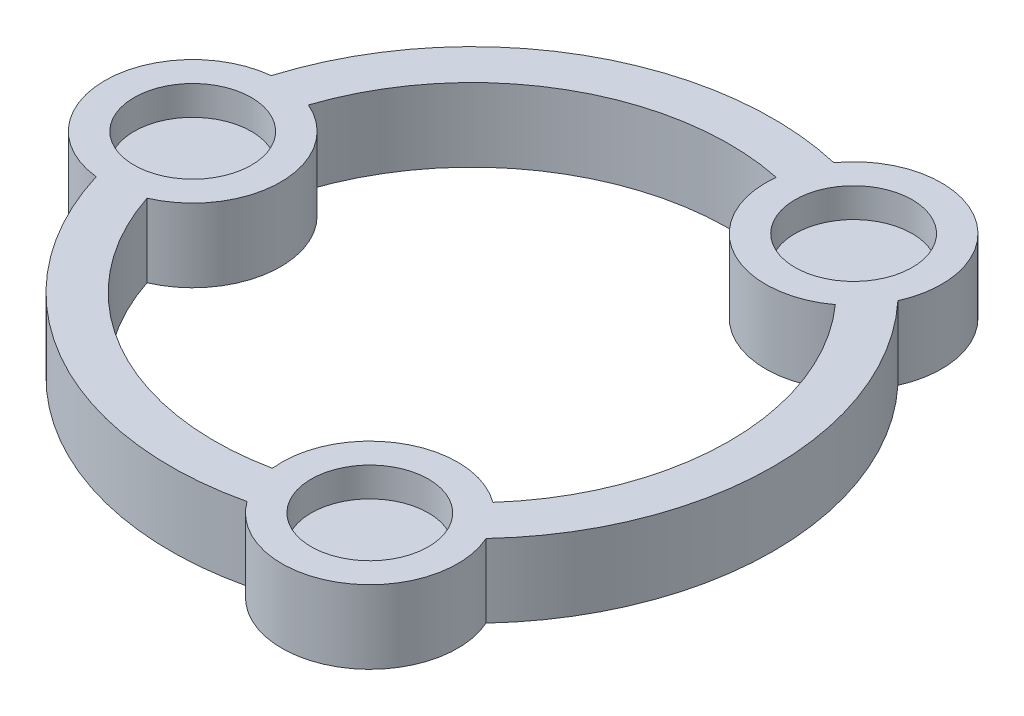
ISO-10303-21;
HEADER;
FILE_DESCRIPTION(('STEP AP214'),'2;1');
FILE_NAME('part.step','',(''),(''),'','','');
FILE_SCHEMA(('AUTOMOTIVE_DESIGN { 1 0 10303 214 1 1 1 1 }'));
ENDSEC;
DATA;
#1=APPLICATION_CONTEXT('core data for automotive mechanical design processes');
#2=APPLICATION_PROTOCOL_DEFINITION('international standard','automotive_design',2000,#1);
#3=PRODUCT_CONTEXT('',#1,'mechanical');
#4=PRODUCT('Part','Part','',(#3));
#5=PRODUCT_RELATED_PRODUCT_CATEGORY('part','',(#4));
#6=PRODUCT_DEFINITION_FORMATION('','',#4);
#7=PRODUCT_DEFINITION_CONTEXT('part definition',#1,'design');
#8=PRODUCT_DEFINITION('design','',#6,#7);
#9=PRODUCT_DEFINITION_SHAPE('','',#8);
#10=(LENGTH_UNIT() NAMED_UNIT(*) SI_UNIT(.MILLI.,.METRE.));
#11=(NAMED_UNIT(*) PLANE_ANGLE_UNIT() SI_UNIT($,.RADIAN.));
#12=(NAMED_UNIT(*) SI_UNIT($,.STERADIAN.) SOLID_ANGLE_UNIT());
#13=UNCERTAINTY_MEASURE_WITH_UNIT(LENGTH_MEASURE(1.E-05),#10,'distance_accuracy_value','');
#14=(GEOMETRIC_REPRESENTATION_CONTEXT(3) GLOBAL_UNCERTAINTY_ASSIGNED_CONTEXT((#13)) GLOBAL_UNIT_ASSIGNED_CONTEXT((#10,
#11,#12)) REPRESENTATION_CONTEXT('',''));
#15=CARTESIAN_POINT('',(0.,0.,0.));
#16=DIRECTION('',(0.,0.,1.));
#17=DIRECTION('',(1.,0.,0.));
#18=AXIS2_PLACEMENT_3D('',#15,#16,#17);
#19=CARTESIAN_POINT('',(0.,5.,2.99231768478796E-13));
#20=DIRECTION('',(0.,1.,0.));
#21=DIRECTION('',(0.,0.,1.));
#22=AXIS2_PLACEMENT_3D('',#19,#20,#21);
#23=PLANE('',#22);
#24=CARTESIAN_POINT('',(4.05925293378573E-13,5.,0.));
#25=DIRECTION('',(0.,1.,0.));
#26=DIRECTION('',(0.,0.,1.));
#27=AXIS2_PLACEMENT_3D('',#24,#25,#26);
#28=CIRCLE('',#27,17.5500000000002);
#29=CARTESIAN_POINT('',(-16.6644864519089,5.,5.50430661338338));
#30=VERTEX_POINT('',#29);
#31=CARTESIAN_POINT('',(3.56537386854582,5.,17.1840219150669));
#32=VERTEX_POINT('',#31);
#33=EDGE_CURVE('E213',#30,#32,#28,.T.);
#34=ORIENTED_EDGE('',*,*,#33,.F.);
#35=CARTESIAN_POINT('',(-19.0524999999996,5.,0.));
#36=DIRECTION('',(0.,1.,0.));
#37=DIRECTION('',(0.,0.,1.));
#38=AXIS2_PLACEMENT_3D('',#35,#36,#37);
#39=CIRCLE('',#38,6.);
#40=CARTESIAN_POINT('',(-16.6644864519086,5.,-5.50430661338373));
#41=VERTEX_POINT('',#40);
#42=EDGE_CURVE('E185',#30,#41,#39,.T.);
#43=ORIENTED_EDGE('',*,*,#42,.T.);
#44=CARTESIAN_POINT('',(4.05925293378573E-13,5.,0.));
#45=DIRECTION('',(0.,1.,0.));
#46=DIRECTION('',(0.,0.,1.));
#47=AXIS2_PLACEMENT_3D('',#44,#45,#46);
#48=CIRCLE('',#47,17.55);
#49=CARTESIAN_POINT('',(3.56537386854619,5.,-17.1840219150666));
#50=VERTEX_POINT('',#49);
#51=EDGE_CURVE('E196',#50,#41,#48,.T.);
#52=ORIENTED_EDGE('',*,*,#51,.F.);
#53=CARTESIAN_POINT('',(9.52625000000018,5.,-16.4999490056029));
#54=DIRECTION('',(0.,1.,0.));
#55=DIRECTION('',(0.,0.,1.));
#56=AXIS2_PLACEMENT_3D('',#53,#54,#55);
#57=CIRCLE('',#56,6.);
#58=CARTESIAN_POINT('',(13.0991125833636,5.,-11.6797153016834));
#59=VERTEX_POINT('',#58);
#60=EDGE_CURVE('E222',#50,#59,#57,.T.);
#61=ORIENTED_EDGE('',*,*,#60,.T.);
#62=CARTESIAN_POINT('',(4.05925293378573E-13,5.,0.));
#63=DIRECTION('',(0.,1.,0.));
#64=DIRECTION('',(0.,0.,1.));
#65=AXIS2_PLACEMENT_3D('',#62,#63,#64);
#66=CIRCLE('',#65,17.55);
#67=CARTESIAN_POINT('',(13.0991125833638,5.,11.6797153016833));
#68=VERTEX_POINT('',#67);
#69=EDGE_CURVE('E219',#68,#59,#66,.T.);
#70=ORIENTED_EDGE('',*,*,#69,.F.);
#71=CARTESIAN_POINT('',(9.52625000000006,5.,16.4999490056029));
#72=DIRECTION('',(0.,1.,0.));
#73=DIRECTION('',(0.,0.,1.));
#74=AXIS2_PLACEMENT_3D('',#71,#72,#73);
#75=CIRCLE('',#74,6.00000000000029);
#76=EDGE_CURVE('E216',#68,#32,#75,.T.);
#77=ORIENTED_EDGE('',*,*,#76,.T.);
#78=EDGE_LOOP('',(#34,#43,#52,#61,#70,#77));
#79=FACE_BOUND('',#78,.T.);
#80=CARTESIAN_POINT('',(9.52625000000006,5.,16.4999490056029));
#81=DIRECTION('',(0.,-1.,0.));
#82=DIRECTION('',(0.,0.,-1.));
#83=AXIS2_PLACEMENT_3D('',#80,#81,#82);
#84=CIRCLE('',#83,4.);
#85=CARTESIAN_POINT('',(9.52625000000006,5.,12.4999490056029));
#86=VERTEX_POINT('',#85);
#87=EDGE_CURVE('E243',#86,#86,#84,.T.);
#88=ORIENTED_EDGE('',*,*,#87,.T.);
#89=EDGE_LOOP('',(#88));
#90=FACE_BOUND('',#89,.T.);
#91=CARTESIAN_POINT('',(9.52625000000018,5.,-16.4999490056029));
#92=DIRECTION('',(0.,-1.,0.));
#93=DIRECTION('',(0.,0.,-1.));
#94=AXIS2_PLACEMENT_3D('',#91,#92,#93);
#95=CIRCLE('',#94,4.);
#96=CARTESIAN_POINT('',(9.52625000000018,5.,-20.4999490056029));
#97=VERTEX_POINT('',#96);
#98=EDGE_CURVE('E59',#97,#97,#95,.T.);
#99=ORIENTED_EDGE('',*,*,#98,.T.);
#100=EDGE_LOOP('',(#99));
#101=FACE_BOUND('',#100,.T.);
#102=CARTESIAN_POINT('',(-19.0524999999996,5.,0.));
#103=DIRECTION('',(0.,-1.,0.));
#104=DIRECTION('',(0.,0.,-1.));
#105=AXIS2_PLACEMENT_3D('',#102,#103,#104);
#106=CIRCLE('',#105,4.);
#107=CARTESIAN_POINT('',(-19.0524999999996,5.,-3.99999999999994));
#108=VERTEX_POINT('',#107);
#109=EDGE_CURVE('E229',#108,#108,#106,.T.);
#110=ORIENTED_EDGE('',*,*,#109,.T.);
#111=EDGE_LOOP('',(#110));
#112=FACE_BOUND('',#111,.T.);
#113=CARTESIAN_POINT('',(0.,5.,2.99231768478796E-13));
#114=DIRECTION('',(0.,1.,0.));
#115=DIRECTION('',(0.,0.,1.));
#116=AXIS2_PLACEMENT_3D('',#113,#114,#115);
#117=CIRCLE('',#116,20.5500000000001);
#118=CARTESIAN_POINT('',(4.66295889171505,5.,-20.0139779747597));
#119=VERTEX_POINT('',#118);
#120=CARTESIAN_POINT('',(-19.6640928027817,5.,-5.96874813035245));
#121=VERTEX_POINT('',#120);
#122=EDGE_CURVE('E173',#119,#121,#117,.T.);
#123=ORIENTED_EDGE('',*,*,#122,.T.);
#124=CARTESIAN_POINT('',(-19.0524999999996,5.,0.));
#125=DIRECTION('',(0.,1.,0.));
#126=DIRECTION('',(0.,0.,1.));
#127=AXIS2_PLACEMENT_3D('',#124,#125,#126);
#128=CIRCLE('',#127,6.);
#129=CARTESIAN_POINT('',(-19.6640928027814,5.,5.96874813035254));
#130=VERTEX_POINT('',#129);
#131=EDGE_CURVE('E70',#121,#130,#128,.T.);
#132=ORIENTED_EDGE('',*,*,#131,.T.);
#133=CARTESIAN_POINT('',(0.,5.,2.99231768478796E-13));
#134=DIRECTION('',(0.,1.,0.));
#135=DIRECTION('',(0.,0.,1.));
#136=AXIS2_PLACEMENT_3D('',#133,#134,#135);
#137=CIRCLE('',#136,20.5499999999997);
#138=CARTESIAN_POINT('',(4.66295889171485,5.,20.01397797476));
#139=VERTEX_POINT('',#138);
#140=EDGE_CURVE('E160',#130,#139,#137,.T.);
#141=ORIENTED_EDGE('',*,*,#140,.T.);
#142=CARTESIAN_POINT('',(9.52625000000006,5.,16.4999490056029));
#143=DIRECTION('',(0.,1.,0.));
#144=DIRECTION('',(0.,0.,1.));
#145=AXIS2_PLACEMENT_3D('',#142,#143,#144);
#146=CIRCLE('',#145,6.00000000000014);
#147=CARTESIAN_POINT('',(15.0011339110674,5.,14.0452298444078));
#148=VERTEX_POINT('',#147);
#149=EDGE_CURVE('E163',#139,#148,#146,.T.);
#150=ORIENTED_EDGE('',*,*,#149,.T.);
#151=CARTESIAN_POINT('',(0.,5.,2.99231768478796E-13));
#152=DIRECTION('',(0.,1.,0.));
#153=DIRECTION('',(0.,0.,1.));
#154=AXIS2_PLACEMENT_3D('',#151,#152,#153);
#155=CIRCLE('',#154,20.5500000000002);
#156=CARTESIAN_POINT('',(15.0011339110671,5.,-14.0452298444075));
#157=VERTEX_POINT('',#156);
#158=EDGE_CURVE('E178',#148,#157,#155,.T.);
#159=ORIENTED_EDGE('',*,*,#158,.T.);
#160=CARTESIAN_POINT('',(9.52625000000018,5.,-16.4999490056029));
#161=DIRECTION('',(0.,1.,0.));
#162=DIRECTION('',(0.,0.,1.));
#163=AXIS2_PLACEMENT_3D('',#160,#161,#162);
#164=CIRCLE('',#163,6.);
#165=EDGE_CURVE('E175',#157,#119,#164,.T.);
#166=ORIENTED_EDGE('',*,*,#165,.T.);
#167=EDGE_LOOP('',(#123,#132,#141,#150,#159,#166));
#168=FACE_BOUND('',#167,.T.);
#169=ADVANCED_FACE('F55',(#79,#90,#101,#112,#168),#23,.T.);
#170=CARTESIAN_POINT('',(0.,0.,2.99231768478796E-13));
#171=DIRECTION('',(0.,1.,0.));
#172=DIRECTION('',(0.,0.,1.));
#173=AXIS2_PLACEMENT_3D('',#170,#171,#172);
#174=PLANE('',#173);
#175=CARTESIAN_POINT('',(-19.0524999999996,0.,0.));
#176=DIRECTION('',(0.,1.,0.));
#177=DIRECTION('',(0.,0.,1.));
#178=AXIS2_PLACEMENT_3D('',#175,#176,#177);
#179=CIRCLE('',#178,6.);
#180=CARTESIAN_POINT('',(-16.6644864519089,0.,5.50430661338338));
#181=VERTEX_POINT('',#180);
#182=CARTESIAN_POINT('',(-16.6644864519086,0.,-5.50430661338373));
#183=VERTEX_POINT('',#182);
#184=EDGE_CURVE('E193',#181,#183,#179,.T.);
#185=ORIENTED_EDGE('',*,*,#184,.F.);
#186=CARTESIAN_POINT('',(4.05925293378573E-13,0.,0.));
#187=DIRECTION('',(0.,1.,0.));
#188=DIRECTION('',(0.,0.,1.));
#189=AXIS2_PLACEMENT_3D('',#186,#187,#188);
#190=CIRCLE('',#189,17.5500000000002);
#191=CARTESIAN_POINT('',(3.56537386854582,0.,17.1840219150669));
#192=VERTEX_POINT('',#191);
#193=EDGE_CURVE('E195',#181,#192,#190,.T.);
#194=ORIENTED_EDGE('',*,*,#193,.T.);
#195=CARTESIAN_POINT('',(9.52625000000006,0.,16.4999490056029));
#196=DIRECTION('',(0.,1.,0.));
#197=DIRECTION('',(0.,0.,1.));
#198=AXIS2_PLACEMENT_3D('',#195,#196,#197);
#199=CIRCLE('',#198,6.00000000000029);
#200=CARTESIAN_POINT('',(13.0991125833638,0.,11.6797153016833));
#201=VERTEX_POINT('',#200);
#202=EDGE_CURVE('E199',#201,#192,#199,.T.);
#203=ORIENTED_EDGE('',*,*,#202,.F.);
#204=CARTESIAN_POINT('',(4.05925293378573E-13,0.,0.));
#205=DIRECTION('',(0.,1.,0.));
#206=DIRECTION('',(0.,0.,1.));
#207=AXIS2_PLACEMENT_3D('',#204,#205,#206);
#208=CIRCLE('',#207,17.55);
#209=CARTESIAN_POINT('',(13.0991125833636,0.,-11.6797153016834));
#210=VERTEX_POINT('',#209);
#211=EDGE_CURVE('E202',#201,#210,#208,.T.);
#212=ORIENTED_EDGE('',*,*,#211,.T.);
#213=CARTESIAN_POINT('',(9.52625000000018,0.,-16.4999490056029));
#214=DIRECTION('',(0.,1.,0.));
#215=DIRECTION('',(0.,0.,1.));
#216=AXIS2_PLACEMENT_3D('',#213,#214,#215);
#217=CIRCLE('',#216,6.);
#218=CARTESIAN_POINT('',(3.56537386854619,0.,-17.1840219150666));
#219=VERTEX_POINT('',#218);
#220=EDGE_CURVE('E205',#219,#210,#217,.T.);
#221=ORIENTED_EDGE('',*,*,#220,.F.);
#222=CARTESIAN_POINT('',(4.05925293378573E-13,0.,0.));
#223=DIRECTION('',(0.,1.,0.));
#224=DIRECTION('',(0.,0.,1.));
#225=AXIS2_PLACEMENT_3D('',#222,#223,#224);
#226=CIRCLE('',#225,17.55);
#227=EDGE_CURVE('E207',#219,#183,#226,.T.);
#228=ORIENTED_EDGE('',*,*,#227,.T.);
#229=EDGE_LOOP('',(#185,#194,#203,#212,#221,#228));
#230=FACE_BOUND('',#229,.T.);
#231=CARTESIAN_POINT('',(-19.0524999999996,0.,0.));
#232=DIRECTION('',(0.,1.,0.));
#233=DIRECTION('',(0.,0.,1.));
#234=AXIS2_PLACEMENT_3D('',#231,#232,#233);
#235=CIRCLE('',#234,6.);
#236=CARTESIAN_POINT('',(-19.6640928027817,0.,-5.96874813035245));
#237=VERTEX_POINT('',#236);
#238=CARTESIAN_POINT('',(-19.6640928027814,0.,5.96874813035254));
#239=VERTEX_POINT('',#238);
#240=EDGE_CURVE('E152',#237,#239,#235,.T.);
#241=ORIENTED_EDGE('',*,*,#240,.F.);
#242=CARTESIAN_POINT('',(0.,0.,2.99231768478796E-13));
#243=DIRECTION('',(0.,1.,0.));
#244=DIRECTION('',(0.,0.,1.));
#245=AXIS2_PLACEMENT_3D('',#242,#243,#244);
#246=CIRCLE('',#245,20.5500000000001);
#247=CARTESIAN_POINT('',(4.66295889171505,0.,-20.0139779747597));
#248=VERTEX_POINT('',#247);
#249=EDGE_CURVE('E144',#248,#237,#246,.T.);
#250=ORIENTED_EDGE('',*,*,#249,.F.);
#251=CARTESIAN_POINT('',(9.52625000000018,0.,-16.4999490056029));
#252=DIRECTION('',(0.,1.,0.));
#253=DIRECTION('',(0.,0.,1.));
#254=AXIS2_PLACEMENT_3D('',#251,#252,#253);
#255=CIRCLE('',#254,6.);
#256=CARTESIAN_POINT('',(15.0011339110671,0.,-14.0452298444075));
#257=VERTEX_POINT('',#256);
#258=EDGE_CURVE('E151',#257,#248,#255,.T.);
#259=ORIENTED_EDGE('',*,*,#258,.F.);
#260=CARTESIAN_POINT('',(0.,0.,2.99231768478796E-13));
#261=DIRECTION('',(0.,1.,0.));
#262=DIRECTION('',(0.,0.,1.));
#263=AXIS2_PLACEMENT_3D('',#260,#261,#262);
#264=CIRCLE('',#263,20.5500000000002);
#265=CARTESIAN_POINT('',(15.0011339110674,0.,14.0452298444078));
#266=VERTEX_POINT('',#265);
#267=EDGE_CURVE('E167',#266,#257,#264,.T.);
#268=ORIENTED_EDGE('',*,*,#267,.F.);
#269=CARTESIAN_POINT('',(9.52625000000006,0.,16.4999490056029));
#270=DIRECTION('',(0.,1.,0.));
#271=DIRECTION('',(0.,0.,1.));
#272=AXIS2_PLACEMENT_3D('',#269,#270,#271);
#273=CIRCLE('',#272,6.00000000000014);
#274=CARTESIAN_POINT('',(4.66295889171485,0.,20.01397797476));
#275=VERTEX_POINT('',#274);
#276=EDGE_CURVE('E169',#275,#266,#273,.T.);
#277=ORIENTED_EDGE('',*,*,#276,.F.);
#278=CARTESIAN_POINT('',(0.,0.,2.99231768478796E-13));
#279=DIRECTION('',(0.,1.,0.));
#280=DIRECTION('',(0.,0.,1.));
#281=AXIS2_PLACEMENT_3D('',#278,#279,#280);
#282=CIRCLE('',#281,20.5499999999997);
#283=EDGE_CURVE('E156',#239,#275,#282,.T.);
#284=ORIENTED_EDGE('',*,*,#283,.F.);
#285=EDGE_LOOP('',(#241,#250,#259,#268,#277,#284));
#286=FACE_BOUND('',#285,.T.);
#287=ADVANCED_FACE('F57',(#230,#286),#174,.F.);
#288=CARTESIAN_POINT('',(9.52625000000018,3.,-16.4999490056029));
#289=DIRECTION('',(0.,1.,0.));
#290=DIRECTION('',(0.,0.,1.));
#291=AXIS2_PLACEMENT_3D('',#288,#289,#290);
#292=CYLINDRICAL_SURFACE('',#291,4.);
#293=CARTESIAN_POINT('',(9.52625000000018,3.,-16.4999490056029));
#294=DIRECTION('',(0.,-1.,0.));
#295=DIRECTION('',(0.,0.,-1.));
#296=AXIS2_PLACEMENT_3D('',#293,#294,#295);
#297=CIRCLE('',#296,4.);
#298=CARTESIAN_POINT('',(9.52625000000018,3.,-20.4999490056029));
#299=VERTEX_POINT('',#298);
#300=EDGE_CURVE('E12',#299,#299,#297,.T.);
#301=ORIENTED_EDGE('',*,*,#300,.T.);
#302=EDGE_LOOP('',(#301));
#303=FACE_BOUND('',#302,.T.);
#304=ORIENTED_EDGE('',*,*,#98,.F.);
#305=EDGE_LOOP('',(#304));
#306=FACE_BOUND('',#305,.T.);
#307=ADVANCED_FACE('F267',(#303,#306),#292,.F.);
#308=CARTESIAN_POINT('',(9.52625000000018,3.,-16.4999490056029));
#309=DIRECTION('',(0.,-1.,0.));
#310=DIRECTION('',(0.,0.,-1.));
#311=AXIS2_PLACEMENT_3D('',#308,#309,#310);
#312=PLANE('',#311);
#313=ORIENTED_EDGE('',*,*,#300,.F.);
#314=EDGE_LOOP('',(#313));
#315=FACE_BOUND('',#314,.T.);
#316=ADVANCED_FACE('F257',(#315),#312,.F.);
#317=CARTESIAN_POINT('',(9.52625000000006,3.,16.4999490056029));
#318=DIRECTION('',(0.,1.,0.));
#319=DIRECTION('',(0.,0.,1.));
#320=AXIS2_PLACEMENT_3D('',#317,#318,#319);
#321=CYLINDRICAL_SURFACE('',#320,4.);
#322=CARTESIAN_POINT('',(9.52625000000006,3.,16.4999490056029));
#323=DIRECTION('',(0.,-1.,0.));
#324=DIRECTION('',(0.,0.,-1.));
#325=AXIS2_PLACEMENT_3D('',#322,#323,#324);
#326=CIRCLE('',#325,4.);
#327=CARTESIAN_POINT('',(9.52625000000006,3.,12.4999490056029));
#328=VERTEX_POINT('',#327);
#329=EDGE_CURVE('E246',#328,#328,#326,.T.);
#330=ORIENTED_EDGE('',*,*,#329,.T.);
#331=EDGE_LOOP('',(#330));
#332=FACE_BOUND('',#331,.T.);
#333=ORIENTED_EDGE('',*,*,#87,.F.);
#334=EDGE_LOOP('',(#333));
#335=FACE_BOUND('',#334,.T.);
#336=ADVANCED_FACE('F254',(#332,#335),#321,.F.);
#337=CARTESIAN_POINT('',(9.52625000000006,3.,16.4999490056029));
#338=DIRECTION('',(0.,-1.,0.));
#339=DIRECTION('',(0.,0.,-1.));
#340=AXIS2_PLACEMENT_3D('',#337,#338,#339);
#341=PLANE('',#340);
#342=ORIENTED_EDGE('',*,*,#329,.F.);
#343=EDGE_LOOP('',(#342));
#344=FACE_BOUND('',#343,.T.);
#345=ADVANCED_FACE('F256',(#344),#341,.F.);
#346=CARTESIAN_POINT('',(-19.0524999999996,3.,0.));
#347=DIRECTION('',(0.,1.,0.));
#348=DIRECTION('',(0.,0.,1.));
#349=AXIS2_PLACEMENT_3D('',#346,#347,#348);
#350=CYLINDRICAL_SURFACE('',#349,4.);
#351=CARTESIAN_POINT('',(-19.0524999999996,3.,0.));
#352=DIRECTION('',(0.,-1.,0.));
#353=DIRECTION('',(0.,0.,-1.));
#354=AXIS2_PLACEMENT_3D('',#351,#352,#353);
#355=CIRCLE('',#354,4.);
#356=CARTESIAN_POINT('',(-19.0524999999996,3.,-3.99999999999994));
#357=VERTEX_POINT('',#356);
#358=EDGE_CURVE('E240',#357,#357,#355,.T.);
#359=ORIENTED_EDGE('',*,*,#358,.T.);
#360=EDGE_LOOP('',(#359));
#361=FACE_BOUND('',#360,.T.);
#362=ORIENTED_EDGE('',*,*,#109,.F.);
#363=EDGE_LOOP('',(#362));
#364=FACE_BOUND('',#363,.T.);
#365=ADVANCED_FACE('F264',(#361,#364),#350,.F.);
#366=CARTESIAN_POINT('',(-19.0524999999996,3.,0.));
#367=DIRECTION('',(0.,-1.,0.));
#368=DIRECTION('',(0.,0.,-1.));
#369=AXIS2_PLACEMENT_3D('',#366,#367,#368);
#370=PLANE('',#369);
#371=ORIENTED_EDGE('',*,*,#358,.F.);
#372=EDGE_LOOP('',(#371));
#373=FACE_BOUND('',#372,.T.);
#374=ADVANCED_FACE('F342',(#373),#370,.F.);
#375=CARTESIAN_POINT('',(-19.0524999999996,0.,0.));
#376=DIRECTION('',(0.,1.,0.));
#377=DIRECTION('',(0.,0.,1.));
#378=AXIS2_PLACEMENT_3D('',#375,#376,#377);
#379=CYLINDRICAL_SURFACE('',#378,6.);
#380=ORIENTED_EDGE('',*,*,#42,.F.);
#381=DIRECTION('',(0.,1.,0.));
#382=VECTOR('',#381,1.);
#383=CARTESIAN_POINT('',(-16.6644864519089,0.,5.50430661338338));
#384=LINE('',#383,#382);
#385=EDGE_CURVE('E210',#181,#30,#384,.T.);
#386=ORIENTED_EDGE('',*,*,#385,.F.);
#387=ORIENTED_EDGE('',*,*,#184,.T.);
#388=DIRECTION('',(0.,1.,0.));
#389=VECTOR('',#388,1.);
#390=CARTESIAN_POINT('',(-16.6644864519086,0.,-5.50430661338373));
#391=LINE('',#390,#389);
#392=EDGE_CURVE('E227',#183,#41,#391,.T.);
#393=ORIENTED_EDGE('',*,*,#392,.T.);
#394=EDGE_LOOP('',(#380,#386,#387,#393));
#395=FACE_BOUND('',#394,.T.);
#396=ADVANCED_FACE('F324',(#395),#379,.T.);
#397=CARTESIAN_POINT('',(4.05925293378573E-13,0.,0.));
#398=DIRECTION('',(0.,1.,0.));
#399=DIRECTION('',(0.,0.,1.));
#400=AXIS2_PLACEMENT_3D('',#397,#398,#399);
#401=CYLINDRICAL_SURFACE('',#400,17.55);
#402=ORIENTED_EDGE('',*,*,#51,.T.);
#403=ORIENTED_EDGE('',*,*,#392,.F.);
#404=ORIENTED_EDGE('',*,*,#227,.F.);
#405=DIRECTION('',(0.,1.,0.));
#406=VECTOR('',#405,1.);
#407=CARTESIAN_POINT('',(3.56537386854619,0.,-17.1840219150666));
#408=LINE('',#407,#406);
#409=EDGE_CURVE('E230',#219,#50,#408,.T.);
#410=ORIENTED_EDGE('',*,*,#409,.T.);
#411=EDGE_LOOP('',(#402,#403,#404,#410));
#412=FACE_BOUND('',#411,.T.);
#413=ADVANCED_FACE('F320',(#412),#401,.F.);
#414=CARTESIAN_POINT('',(9.52625000000018,0.,-16.4999490056029));
#415=DIRECTION('',(0.,1.,0.));
#416=DIRECTION('',(0.,0.,1.));
#417=AXIS2_PLACEMENT_3D('',#414,#415,#416);
#418=CYLINDRICAL_SURFACE('',#417,6.);
#419=ORIENTED_EDGE('',*,*,#60,.F.);
#420=ORIENTED_EDGE('',*,*,#409,.F.);
#421=ORIENTED_EDGE('',*,*,#220,.T.);
#422=DIRECTION('',(0.,1.,0.));
#423=VECTOR('',#422,1.);
#424=CARTESIAN_POINT('',(13.0991125833636,0.,-11.6797153016834));
#425=LINE('',#424,#423);
#426=EDGE_CURVE('E232',#210,#59,#425,.T.);
#427=ORIENTED_EDGE('',*,*,#426,.T.);
#428=EDGE_LOOP('',(#419,#420,#421,#427));
#429=FACE_BOUND('',#428,.T.);
#430=ADVANCED_FACE('F323',(#429),#418,.T.);
#431=CARTESIAN_POINT('',(4.05925293378573E-13,0.,0.));
#432=DIRECTION('',(0.,1.,0.));
#433=DIRECTION('',(0.,0.,1.));
#434=AXIS2_PLACEMENT_3D('',#431,#432,#433);
#435=CYLINDRICAL_SURFACE('',#434,17.55);
#436=ORIENTED_EDGE('',*,*,#69,.T.);
#437=ORIENTED_EDGE('',*,*,#426,.F.);
#438=ORIENTED_EDGE('',*,*,#211,.F.);
#439=DIRECTION('',(0.,1.,0.));
#440=VECTOR('',#439,1.);
#441=CARTESIAN_POINT('',(13.0991125833638,0.,11.6797153016833));
#442=LINE('',#441,#440);
#443=EDGE_CURVE('E234',#201,#68,#442,.T.);
#444=ORIENTED_EDGE('',*,*,#443,.T.);
#445=EDGE_LOOP('',(#436,#437,#438,#444));
#446=FACE_BOUND('',#445,.T.);
#447=ADVANCED_FACE('F328',(#446),#435,.F.);
#448=CARTESIAN_POINT('',(9.52625000000006,0.,16.4999490056029));
#449=DIRECTION('',(0.,1.,0.));
#450=DIRECTION('',(0.,0.,1.));
#451=AXIS2_PLACEMENT_3D('',#448,#449,#450);
#452=CYLINDRICAL_SURFACE('',#451,6.00000000000029);
#453=ORIENTED_EDGE('',*,*,#76,.F.);
#454=ORIENTED_EDGE('',*,*,#443,.F.);
#455=ORIENTED_EDGE('',*,*,#202,.T.);
#456=DIRECTION('',(0.,1.,0.));
#457=VECTOR('',#456,1.);
#458=CARTESIAN_POINT('',(3.56537386854582,0.,17.1840219150669));
#459=LINE('',#458,#457);
#460=EDGE_CURVE('E236',#192,#32,#459,.T.);
#461=ORIENTED_EDGE('',*,*,#460,.T.);
#462=EDGE_LOOP('',(#453,#454,#455,#461));
#463=FACE_BOUND('',#462,.T.);
#464=ADVANCED_FACE('F332',(#463),#452,.T.);
#465=CARTESIAN_POINT('',(4.05925293378573E-13,0.,0.));
#466=DIRECTION('',(0.,1.,0.));
#467=DIRECTION('',(0.,0.,1.));
#468=AXIS2_PLACEMENT_3D('',#465,#466,#467);
#469=CYLINDRICAL_SURFACE('',#468,17.5500000000002);
#470=ORIENTED_EDGE('',*,*,#33,.T.);
#471=ORIENTED_EDGE('',*,*,#460,.F.);
#472=ORIENTED_EDGE('',*,*,#193,.F.);
#473=ORIENTED_EDGE('',*,*,#385,.T.);
#474=EDGE_LOOP('',(#470,#471,#472,#473));
#475=FACE_BOUND('',#474,.T.);
#476=ADVANCED_FACE('F311',(#475),#469,.F.);
#477=CARTESIAN_POINT('',(-19.0524999999996,0.,0.));
#478=DIRECTION('',(0.,1.,0.));
#479=DIRECTION('',(0.,0.,1.));
#480=AXIS2_PLACEMENT_3D('',#477,#478,#479);
#481=CYLINDRICAL_SURFACE('',#480,6.);
#482=ORIENTED_EDGE('',*,*,#131,.F.);
#483=DIRECTION('',(0.,1.,0.));
#484=VECTOR('',#483,1.);
#485=CARTESIAN_POINT('',(-19.6640928027817,0.,-5.96874813035245));
#486=LINE('',#485,#484);
#487=EDGE_CURVE('E146',#237,#121,#486,.T.);
#488=ORIENTED_EDGE('',*,*,#487,.F.);
#489=ORIENTED_EDGE('',*,*,#240,.T.);
#490=DIRECTION('',(0.,1.,0.));
#491=VECTOR('',#490,1.);
#492=CARTESIAN_POINT('',(-19.6640928027814,0.,5.96874813035254));
#493=LINE('',#492,#491);
#494=EDGE_CURVE('E183',#239,#130,#493,.T.);
#495=ORIENTED_EDGE('',*,*,#494,.T.);
#496=EDGE_LOOP('',(#482,#488,#489,#495));
#497=FACE_BOUND('',#496,.T.);
#498=ADVANCED_FACE('F154',(#497),#481,.T.);
#499=CARTESIAN_POINT('',(0.,0.,2.99231768478796E-13));
#500=DIRECTION('',(0.,1.,0.));
#501=DIRECTION('',(0.,0.,1.));
#502=AXIS2_PLACEMENT_3D('',#499,#500,#501);
#503=CYLINDRICAL_SURFACE('',#502,20.5499999999997);
#504=ORIENTED_EDGE('',*,*,#140,.F.);
#505=ORIENTED_EDGE('',*,*,#494,.F.);
#506=ORIENTED_EDGE('',*,*,#283,.T.);
#507=DIRECTION('',(0.,1.,0.));
#508=VECTOR('',#507,1.);
#509=CARTESIAN_POINT('',(4.66295889171485,0.,20.01397797476));
#510=LINE('',#509,#508);
#511=EDGE_CURVE('E186',#275,#139,#510,.T.);
#512=ORIENTED_EDGE('',*,*,#511,.T.);
#513=EDGE_LOOP('',(#504,#505,#506,#512));
#514=FACE_BOUND('',#513,.T.);
#515=ADVANCED_FACE('F303',(#514),#503,.T.);
#516=CARTESIAN_POINT('',(9.52625000000006,0.,16.4999490056029));
#517=DIRECTION('',(0.,1.,0.));
#518=DIRECTION('',(0.,0.,1.));
#519=AXIS2_PLACEMENT_3D('',#516,#517,#518);
#520=CYLINDRICAL_SURFACE('',#519,6.00000000000014);
#521=ORIENTED_EDGE('',*,*,#149,.F.);
#522=ORIENTED_EDGE('',*,*,#511,.F.);
#523=ORIENTED_EDGE('',*,*,#276,.T.);
#524=DIRECTION('',(0.,1.,0.));
#525=VECTOR('',#524,1.);
#526=CARTESIAN_POINT('',(15.0011339110674,0.,14.0452298444078));
#527=LINE('',#526,#525);
#528=EDGE_CURVE('E188',#266,#148,#527,.T.);
#529=ORIENTED_EDGE('',*,*,#528,.T.);
#530=EDGE_LOOP('',(#521,#522,#523,#529));
#531=FACE_BOUND('',#530,.T.);
#532=ADVANCED_FACE('F300',(#531),#520,.T.);
#533=CARTESIAN_POINT('',(0.,0.,2.99231768478796E-13));
#534=DIRECTION('',(0.,1.,0.));
#535=DIRECTION('',(0.,0.,1.));
#536=AXIS2_PLACEMENT_3D('',#533,#534,#535);
#537=CYLINDRICAL_SURFACE('',#536,20.5500000000002);
#538=ORIENTED_EDGE('',*,*,#158,.F.);
#539=ORIENTED_EDGE('',*,*,#528,.F.);
#540=ORIENTED_EDGE('',*,*,#267,.T.);
#541=DIRECTION('',(0.,1.,0.));
#542=VECTOR('',#541,1.);
#543=CARTESIAN_POINT('',(15.0011339110671,0.,-14.0452298444075));
#544=LINE('',#543,#542);
#545=EDGE_CURVE('E190',#257,#157,#544,.T.);
#546=ORIENTED_EDGE('',*,*,#545,.T.);
#547=EDGE_LOOP('',(#538,#539,#540,#546));
#548=FACE_BOUND('',#547,.T.);
#549=ADVANCED_FACE('F297',(#548),#537,.T.);
#550=CARTESIAN_POINT('',(9.52625000000018,0.,-16.4999490056029));
#551=DIRECTION('',(0.,1.,0.));
#552=DIRECTION('',(0.,0.,1.));
#553=AXIS2_PLACEMENT_3D('',#550,#551,#552);
#554=CYLINDRICAL_SURFACE('',#553,6.);
#555=ORIENTED_EDGE('',*,*,#165,.F.);
#556=ORIENTED_EDGE('',*,*,#545,.F.);
#557=ORIENTED_EDGE('',*,*,#258,.T.);
#558=DIRECTION('',(0.,1.,0.));
#559=VECTOR('',#558,1.);
#560=CARTESIAN_POINT('',(4.66295889171505,0.,-20.0139779747597));
#561=LINE('',#560,#559);
#562=EDGE_CURVE('E78',#248,#119,#561,.T.);
#563=ORIENTED_EDGE('',*,*,#562,.T.);
#564=EDGE_LOOP('',(#555,#556,#557,#563));
#565=FACE_BOUND('',#564,.T.);
#566=ADVANCED_FACE('F293',(#565),#554,.T.);
#567=CARTESIAN_POINT('',(0.,0.,2.99231768478796E-13));
#568=DIRECTION('',(0.,1.,0.));
#569=DIRECTION('',(0.,0.,1.));
#570=AXIS2_PLACEMENT_3D('',#567,#568,#569);
#571=CYLINDRICAL_SURFACE('',#570,20.5500000000001);
#572=ORIENTED_EDGE('',*,*,#122,.F.);
#573=ORIENTED_EDGE('',*,*,#562,.F.);
#574=ORIENTED_EDGE('',*,*,#249,.T.);
#575=ORIENTED_EDGE('',*,*,#487,.T.);
#576=EDGE_LOOP('',(#572,#573,#574,#575));
#577=FACE_BOUND('',#576,.T.);
#578=ADVANCED_FACE('F145',(#577),#571,.T.);
#579=CLOSED_SHELL('',(#169,#287,#307,#316,#336,#345,#365,#374,#396,#413,#430,#447,#464,#476,
#498,#515,#532,#549,#566,#578));
#580=MANIFOLD_SOLID_BREP('B2',#579);
#581=ADVANCED_BREP_SHAPE_REPRESENTATION('',(#18,#580),#14);
#582=SHAPE_DEFINITION_REPRESENTATION(#9,#581);
ENDSEC;
END-ISO-10303-21;
